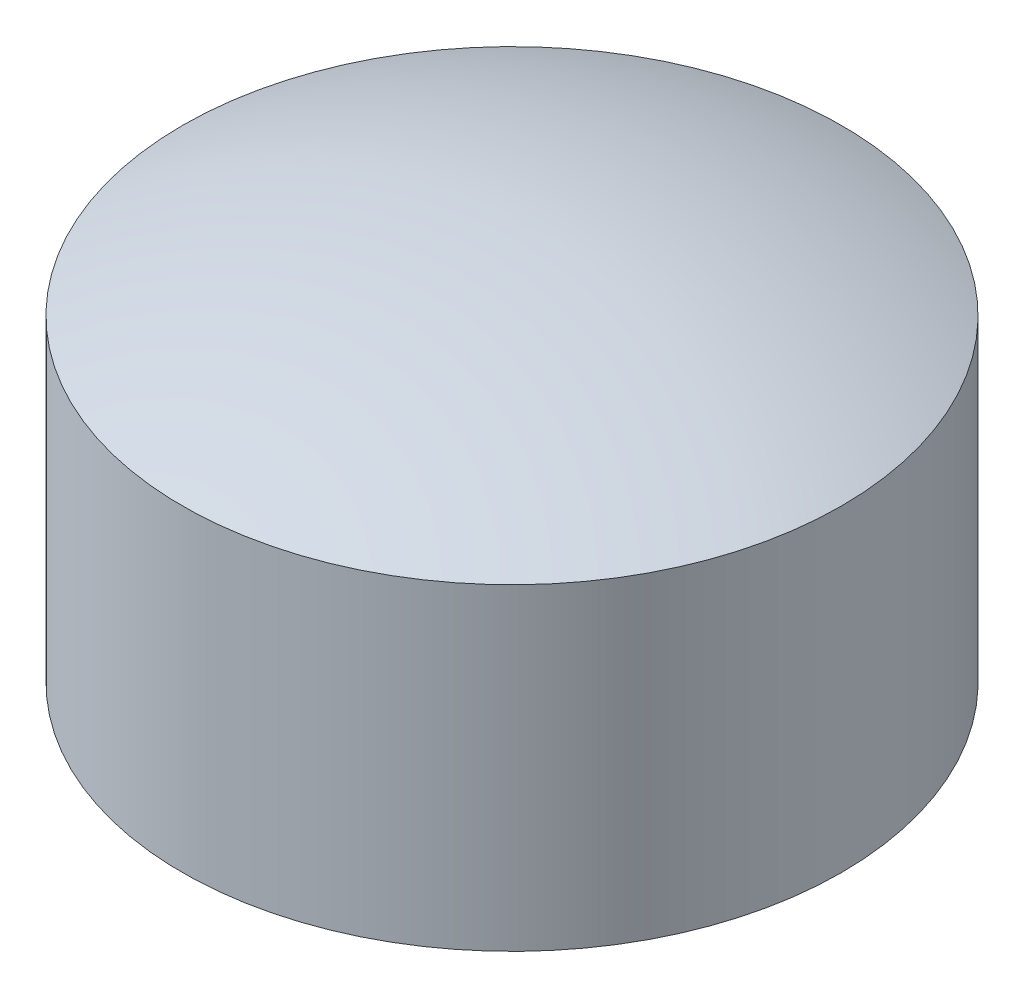
ISO-10303-21;
HEADER;
FILE_DESCRIPTION(('STEP AP214'),'2;1');
FILE_NAME('part.step','',(''),(''),'','','');
FILE_SCHEMA(('AUTOMOTIVE_DESIGN { 1 0 10303 214 1 1 1 1 }'));
ENDSEC;
DATA;
#1=APPLICATION_CONTEXT('core data for automotive mechanical design processes');
#2=APPLICATION_PROTOCOL_DEFINITION('international standard','automotive_design',2000,#1);
#3=PRODUCT_CONTEXT('',#1,'mechanical');
#4=PRODUCT('Part','Part','',(#3));
#5=PRODUCT_RELATED_PRODUCT_CATEGORY('part','',(#4));
#6=PRODUCT_DEFINITION_FORMATION('','',#4);
#7=PRODUCT_DEFINITION_CONTEXT('part definition',#1,'design');
#8=PRODUCT_DEFINITION('design','',#6,#7);
#9=PRODUCT_DEFINITION_SHAPE('','',#8);
#10=(LENGTH_UNIT() NAMED_UNIT(*) SI_UNIT(.MILLI.,.METRE.));
#11=(NAMED_UNIT(*) PLANE_ANGLE_UNIT() SI_UNIT($,.RADIAN.));
#12=(NAMED_UNIT(*) SI_UNIT($,.STERADIAN.) SOLID_ANGLE_UNIT());
#13=UNCERTAINTY_MEASURE_WITH_UNIT(LENGTH_MEASURE(1.E-05),#10,'distance_accuracy_value','');
#14=(GEOMETRIC_REPRESENTATION_CONTEXT(3) GLOBAL_UNCERTAINTY_ASSIGNED_CONTEXT((#13)) GLOBAL_UNIT_ASSIGNED_CONTEXT((#10,
#11,#12)) REPRESENTATION_CONTEXT('',''));
#15=CARTESIAN_POINT('',(0.,0.,0.));
#16=DIRECTION('',(0.,0.,1.));
#17=DIRECTION('',(1.,0.,0.));
#18=AXIS2_PLACEMENT_3D('',#15,#16,#17);
#19=CARTESIAN_POINT('',(0.,-1.08617938322771,0.));
#20=DIRECTION('',(0.,1.,0.));
#21=DIRECTION('',(1.,0.,0.));
#22=AXIS2_PLACEMENT_3D('',#19,#20,#21);
#23=SPHERICAL_SURFACE('',#22,2.08617938322771);
#24=CARTESIAN_POINT('',(0.,0.81898318700202,0.));
#25=DIRECTION('',(0.,1.,0.));
#26=DIRECTION('',(-1.,0.,0.));
#27=AXIS2_PLACEMENT_3D('',#24,#25,#26);
#28=CIRCLE('',#27,0.849999999999999);
#29=CARTESIAN_POINT('',(-0.849999999999999,0.818983187002019,0.));
#30=VERTEX_POINT('',#29);
#31=EDGE_CURVE('E10',#30,#30,#28,.T.);
#32=ORIENTED_EDGE('',*,*,#31,.T.);
#33=EDGE_LOOP('',(#32));
#34=FACE_BOUND('',#33,.T.);
#35=ADVANCED_FACE('F33',(#34),#23,.T.);
#36=CARTESIAN_POINT('',(0.,1.75514714063934,0.));
#37=DIRECTION('',(0.,1.,0.));
#38=DIRECTION('',(-1.,0.,0.));
#39=AXIS2_PLACEMENT_3D('',#36,#37,#38);
#40=CYLINDRICAL_SURFACE('',#39,0.85);
#41=CARTESIAN_POINT('',(0.,0.,0.));
#42=DIRECTION('',(0.,1.,0.));
#43=DIRECTION('',(-1.,0.,0.));
#44=AXIS2_PLACEMENT_3D('',#41,#42,#43);
#45=CIRCLE('',#44,0.85);
#46=CARTESIAN_POINT('',(-0.85,0.,0.));
#47=VERTEX_POINT('',#46);
#48=EDGE_CURVE('E39',#47,#47,#45,.T.);
#49=ORIENTED_EDGE('',*,*,#48,.T.);
#50=EDGE_LOOP('',(#49));
#51=FACE_BOUND('',#50,.T.);
#52=ORIENTED_EDGE('',*,*,#31,.F.);
#53=EDGE_LOOP('',(#52));
#54=FACE_BOUND('',#53,.T.);
#55=ADVANCED_FACE('F65',(#51,#54),#40,.T.);
#56=CARTESIAN_POINT('',(-0.85,0.,0.));
#57=DIRECTION('',(0.,-1.,0.));
#58=DIRECTION('',(1.,0.,0.));
#59=AXIS2_PLACEMENT_3D('',#56,#57,#58);
#60=PLANE('',#59);
#61=CARTESIAN_POINT('',(0.,0.,0.));
#62=DIRECTION('',(0.,1.,0.));
#63=DIRECTION('',(-1.,0.,0.));
#64=AXIS2_PLACEMENT_3D('',#61,#62,#63);
#65=CIRCLE('',#64,0.5);
#66=CARTESIAN_POINT('',(-0.5,0.,0.));
#67=VERTEX_POINT('',#66);
#68=EDGE_CURVE('E43',#67,#67,#65,.T.);
#69=ORIENTED_EDGE('',*,*,#68,.T.);
#70=EDGE_LOOP('',(#69));
#71=FACE_BOUND('',#70,.T.);
#72=ORIENTED_EDGE('',*,*,#48,.F.);
#73=EDGE_LOOP('',(#72));
#74=FACE_BOUND('',#73,.T.);
#75=ADVANCED_FACE('F62',(#71,#74),#60,.T.);
#76=CARTESIAN_POINT('',(0.,1.75514714063934,0.));
#77=DIRECTION('',(0.,1.,0.));
#78=DIRECTION('',(-1.,0.,0.));
#79=AXIS2_PLACEMENT_3D('',#76,#77,#78);
#80=CYLINDRICAL_SURFACE('',#79,0.5);
#81=CARTESIAN_POINT('',(0.,0.5,0.));
#82=DIRECTION('',(0.,1.,0.));
#83=DIRECTION('',(-1.,0.,0.));
#84=AXIS2_PLACEMENT_3D('',#81,#82,#83);
#85=CIRCLE('',#84,0.5);
#86=CARTESIAN_POINT('',(-0.5,0.5,0.));
#87=VERTEX_POINT('',#86);
#88=EDGE_CURVE('E47',#87,#87,#85,.T.);
#89=ORIENTED_EDGE('',*,*,#88,.T.);
#90=EDGE_LOOP('',(#89));
#91=FACE_BOUND('',#90,.T.);
#92=ORIENTED_EDGE('',*,*,#68,.F.);
#93=EDGE_LOOP('',(#92));
#94=FACE_BOUND('',#93,.T.);
#95=ADVANCED_FACE('F53',(#91,#94),#80,.F.);
#96=CARTESIAN_POINT('',(0.,0.5,0.));
#97=DIRECTION('',(0.,-1.,0.));
#98=DIRECTION('',(1.,0.,0.));
#99=AXIS2_PLACEMENT_3D('',#96,#97,#98);
#100=PLANE('',#99);
#101=ORIENTED_EDGE('',*,*,#88,.F.);
#102=EDGE_LOOP('',(#101));
#103=FACE_BOUND('',#102,.T.);
#104=ADVANCED_FACE('F56',(#103),#100,.T.);
#105=CLOSED_SHELL('',(#35,#55,#75,#95,#104));
#106=MANIFOLD_SOLID_BREP('B2',#105);
#107=ADVANCED_BREP_SHAPE_REPRESENTATION('',(#18,#106),#14);
#108=SHAPE_DEFINITION_REPRESENTATION(#9,#107);
ENDSEC;
END-ISO-10303-21;
